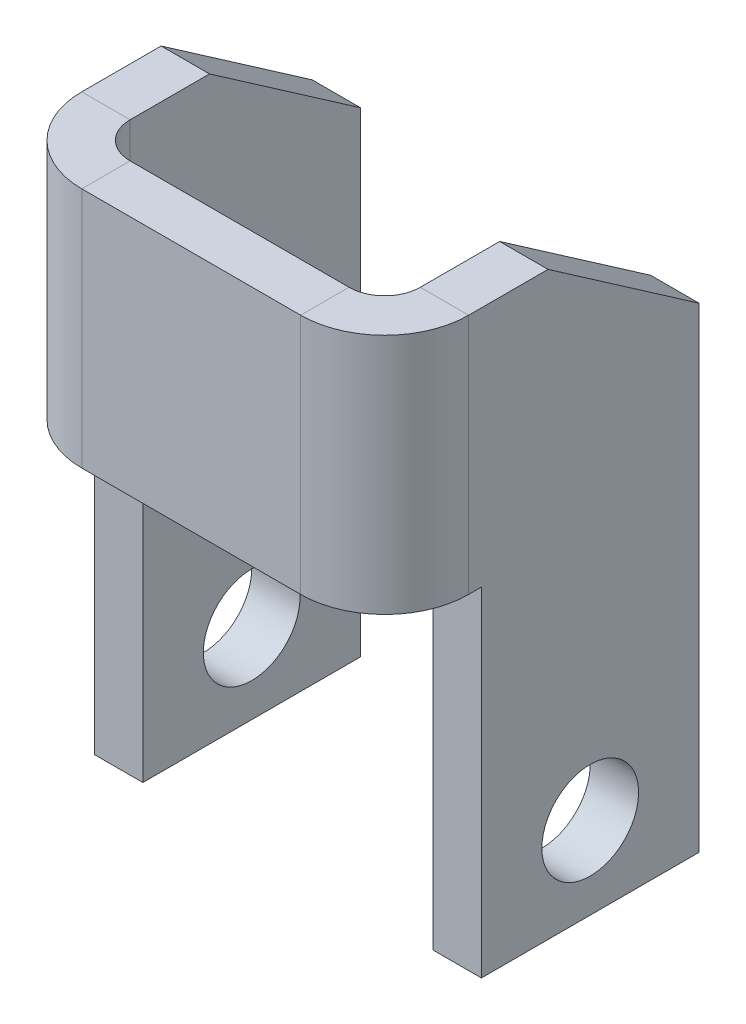
ISO-10303-21;
HEADER;
FILE_DESCRIPTION(('STEP AP214'),'2;1');
FILE_NAME('part.step','',(''),(''),'','','');
FILE_SCHEMA(('AUTOMOTIVE_DESIGN { 1 0 10303 214 1 1 1 1 }'));
ENDSEC;
DATA;
#1=APPLICATION_CONTEXT('core data for automotive mechanical design processes');
#2=APPLICATION_PROTOCOL_DEFINITION('international standard','automotive_design',2000,#1);
#3=PRODUCT_CONTEXT('',#1,'mechanical');
#4=PRODUCT('Part','Part','',(#3));
#5=PRODUCT_RELATED_PRODUCT_CATEGORY('part','',(#4));
#6=PRODUCT_DEFINITION_FORMATION('','',#4);
#7=PRODUCT_DEFINITION_CONTEXT('part definition',#1,'design');
#8=PRODUCT_DEFINITION('design','',#6,#7);
#9=PRODUCT_DEFINITION_SHAPE('','',#8);
#10=(LENGTH_UNIT() NAMED_UNIT(*) SI_UNIT(.MILLI.,.METRE.));
#11=(NAMED_UNIT(*) PLANE_ANGLE_UNIT() SI_UNIT($,.RADIAN.));
#12=(NAMED_UNIT(*) SI_UNIT($,.STERADIAN.) SOLID_ANGLE_UNIT());
#13=UNCERTAINTY_MEASURE_WITH_UNIT(LENGTH_MEASURE(1.E-05),#10,'distance_accuracy_value','');
#14=(GEOMETRIC_REPRESENTATION_CONTEXT(3) GLOBAL_UNCERTAINTY_ASSIGNED_CONTEXT((#13)) GLOBAL_UNIT_ASSIGNED_CONTEXT((#10,
#11,#12)) REPRESENTATION_CONTEXT('',''));
#15=CARTESIAN_POINT('',(0.,0.,0.));
#16=DIRECTION('',(0.,0.,1.));
#17=DIRECTION('',(1.,0.,0.));
#18=AXIS2_PLACEMENT_3D('',#15,#16,#17);
#19=CARTESIAN_POINT('',(0.,0.,-1.));
#20=DIRECTION('',(0.,0.,-1.));
#21=DIRECTION('',(-1.,0.,0.));
#22=AXIS2_PLACEMENT_3D('',#19,#20,#21);
#23=PLANE('',#22);
#24=DIRECTION('',(0.,1.,0.));
#25=VECTOR('',#24,1.);
#26=CARTESIAN_POINT('',(-2.2634,10.5,-1.));
#27=LINE('',#26,#25);
#28=CARTESIAN_POINT('',(-2.2634,1.5,-1.));
#29=VERTEX_POINT('',#28);
#30=CARTESIAN_POINT('',(-2.2634,-3.5,-1.));
#31=VERTEX_POINT('',#30);
#32=EDGE_CURVE('E234',#29,#31,#27,.F.);
#33=ORIENTED_EDGE('',*,*,#32,.F.);
#34=DIRECTION('',(-1.,0.,0.));
#35=VECTOR('',#34,1.);
#36=CARTESIAN_POINT('',(0.,1.5,-1.));
#37=LINE('',#36,#35);
#38=CARTESIAN_POINT('',(2.2634,1.5,-1.));
#39=VERTEX_POINT('',#38);
#40=EDGE_CURVE('E221',#39,#29,#37,.T.);
#41=ORIENTED_EDGE('',*,*,#40,.F.);
#42=DIRECTION('',(0.,-1.,0.));
#43=VECTOR('',#42,1.);
#44=CARTESIAN_POINT('',(2.2634,-10.5,-1.));
#45=LINE('',#44,#43);
#46=CARTESIAN_POINT('',(2.2634,-3.5,-1.));
#47=VERTEX_POINT('',#46);
#48=EDGE_CURVE('E292',#47,#39,#45,.F.);
#49=ORIENTED_EDGE('',*,*,#48,.F.);
#50=DIRECTION('',(1.,0.,0.));
#51=VECTOR('',#50,1.);
#52=CARTESIAN_POINT('',(0.,-3.5,-1.));
#53=LINE('',#52,#51);
#54=EDGE_CURVE('E241',#31,#47,#53,.T.);
#55=ORIENTED_EDGE('',*,*,#54,.F.);
#56=EDGE_LOOP('',(#33,#41,#49,#55));
#57=FACE_BOUND('',#56,.T.);
#58=ADVANCED_FACE('F80',(#57),#23,.T.);
#59=CARTESIAN_POINT('',(0.,0.,0.));
#60=DIRECTION('',(0.,0.,-1.));
#61=DIRECTION('',(-1.,0.,0.));
#62=AXIS2_PLACEMENT_3D('',#59,#60,#61);
#63=PLANE('',#62);
#64=DIRECTION('',(-1.,0.,0.));
#65=VECTOR('',#64,1.);
#66=CARTESIAN_POINT('',(0.,1.5,0.));
#67=LINE('',#66,#65);
#68=CARTESIAN_POINT('',(2.2634,1.5,0.));
#69=VERTEX_POINT('',#68);
#70=CARTESIAN_POINT('',(-2.2634,1.5,0.));
#71=VERTEX_POINT('',#70);
#72=EDGE_CURVE('E228',#69,#71,#67,.T.);
#73=ORIENTED_EDGE('',*,*,#72,.T.);
#74=DIRECTION('',(0.,1.,0.));
#75=VECTOR('',#74,1.);
#76=CARTESIAN_POINT('',(-2.2634,10.5,0.));
#77=LINE('',#76,#75);
#78=CARTESIAN_POINT('',(-2.26340000000001,-3.5,0.));
#79=VERTEX_POINT('',#78);
#80=EDGE_CURVE('E242',#71,#79,#77,.F.);
#81=ORIENTED_EDGE('',*,*,#80,.T.);
#82=DIRECTION('',(1.,0.,0.));
#83=VECTOR('',#82,1.);
#84=CARTESIAN_POINT('',(-6.,-3.5,0.));
#85=LINE('',#84,#83);
#86=CARTESIAN_POINT('',(2.2634,-3.5,0.));
#87=VERTEX_POINT('',#86);
#88=EDGE_CURVE('E265',#79,#87,#85,.T.);
#89=ORIENTED_EDGE('',*,*,#88,.T.);
#90=DIRECTION('',(0.,-1.,0.));
#91=VECTOR('',#90,1.);
#92=CARTESIAN_POINT('',(2.2634,-10.5,0.));
#93=LINE('',#92,#91);
#94=EDGE_CURVE('E283',#87,#69,#93,.F.);
#95=ORIENTED_EDGE('',*,*,#94,.T.);
#96=EDGE_LOOP('',(#73,#81,#89,#95));
#97=FACE_BOUND('',#96,.T.);
#98=ADVANCED_FACE('F82',(#97),#63,.F.);
#99=CARTESIAN_POINT('',(-2.2634,10.5,-1.7366));
#100=DIRECTION('',(0.,1.,0.));
#101=DIRECTION('',(-1.,0.,0.));
#102=AXIS2_PLACEMENT_3D('',#99,#100,#101);
#103=CYLINDRICAL_SURFACE('',#102,1.7366);
#104=ORIENTED_EDGE('',*,*,#80,.F.);
#105=CARTESIAN_POINT('',(-2.2634,1.5,-1.7366));
#106=DIRECTION('',(0.,-1.,0.));
#107=DIRECTION('',(0.,0.,-1.));
#108=AXIS2_PLACEMENT_3D('',#105,#106,#107);
#109=CIRCLE('',#108,1.7366);
#110=CARTESIAN_POINT('',(-4.,1.5,-1.73659999999999));
#111=VERTEX_POINT('',#110);
#112=EDGE_CURVE('E213',#111,#71,#109,.F.);
#113=ORIENTED_EDGE('',*,*,#112,.F.);
#114=DIRECTION('',(0.,1.,0.));
#115=VECTOR('',#114,1.);
#116=CARTESIAN_POINT('',(-4.,-10.5,-1.73659999999999));
#117=LINE('',#116,#115);
#118=CARTESIAN_POINT('',(-4.,-3.5,-1.73659999999999));
#119=VERTEX_POINT('',#118);
#120=EDGE_CURVE('E294',#111,#119,#117,.F.);
#121=ORIENTED_EDGE('',*,*,#120,.T.);
#122=CARTESIAN_POINT('',(-2.2634,-3.5,-1.7366));
#123=DIRECTION('',(0.,1.,0.));
#124=DIRECTION('',(0.,0.,1.));
#125=AXIS2_PLACEMENT_3D('',#122,#123,#124);
#126=CIRCLE('',#125,1.7366);
#127=EDGE_CURVE('E314',#79,#119,#126,.F.);
#128=ORIENTED_EDGE('',*,*,#127,.F.);
#129=EDGE_LOOP('',(#104,#113,#121,#128));
#130=FACE_BOUND('',#129,.T.);
#131=ADVANCED_FACE('F312',(#130),#103,.T.);
#132=CARTESIAN_POINT('',(-2.2634,10.5,-1.7366));
#133=DIRECTION('',(0.,1.,0.));
#134=DIRECTION('',(-1.,0.,0.));
#135=AXIS2_PLACEMENT_3D('',#132,#133,#134);
#136=CYLINDRICAL_SURFACE('',#135,0.7366);
#137=CARTESIAN_POINT('',(-2.2634,1.5,-1.7366));
#138=DIRECTION('',(0.,1.,0.));
#139=DIRECTION('',(0.,0.,1.));
#140=AXIS2_PLACEMENT_3D('',#137,#138,#139);
#141=CIRCLE('',#140,0.7366);
#142=CARTESIAN_POINT('',(-3.,1.5,-1.7366));
#143=VERTEX_POINT('',#142);
#144=EDGE_CURVE('E210',#143,#29,#141,.T.);
#145=ORIENTED_EDGE('',*,*,#144,.T.);
#146=ORIENTED_EDGE('',*,*,#32,.T.);
#147=CARTESIAN_POINT('',(-2.2634,-3.5,-1.7366));
#148=DIRECTION('',(0.,1.,0.));
#149=DIRECTION('',(0.,0.,1.));
#150=AXIS2_PLACEMENT_3D('',#147,#148,#149);
#151=CIRCLE('',#150,0.7366);
#152=CARTESIAN_POINT('',(-3.,-3.5,-1.7366));
#153=VERTEX_POINT('',#152);
#154=EDGE_CURVE('E382',#31,#153,#151,.F.);
#155=ORIENTED_EDGE('',*,*,#154,.T.);
#156=DIRECTION('',(0.,1.,0.));
#157=VECTOR('',#156,1.);
#158=CARTESIAN_POINT('',(-3.,-10.5,-1.7366));
#159=LINE('',#158,#157);
#160=EDGE_CURVE('E237',#153,#143,#159,.T.);
#161=ORIENTED_EDGE('',*,*,#160,.T.);
#162=EDGE_LOOP('',(#145,#146,#155,#161));
#163=FACE_BOUND('',#162,.T.);
#164=ADVANCED_FACE('F232',(#163),#136,.F.);
#165=CARTESIAN_POINT('',(-4.,0.,0.));
#166=DIRECTION('',(1.,0.,0.));
#167=DIRECTION('',(0.,0.,-1.));
#168=AXIS2_PLACEMENT_3D('',#165,#166,#167);
#169=PLANE('',#168);
#170=CARTESIAN_POINT('',(-4.00000000000001,-8.8,-4.25000000000003));
#171=DIRECTION('',(1.,0.,0.));
#172=DIRECTION('',(0.,0.,-1.));
#173=AXIS2_PLACEMENT_3D('',#170,#171,#172);
#174=CIRCLE('',#173,1.);
#175=CARTESIAN_POINT('',(-4.00000000000002,-8.8,-5.25000000000003));
#176=VERTEX_POINT('',#175);
#177=EDGE_CURVE('E413',#176,#176,#174,.F.);
#178=ORIENTED_EDGE('',*,*,#177,.F.);
#179=EDGE_LOOP('',(#178));
#180=FACE_BOUND('',#179,.T.);
#181=DIRECTION('',(0.,-0.570049767381845,-0.821610164681465));
#182=VECTOR('',#181,1.);
#183=CARTESIAN_POINT('',(-4.,2.59445903024732,-1.80008820514969));
#184=LINE('',#183,#182);
#185=CARTESIAN_POINT('',(-4.00000000000001,1.5,-3.37752708072121));
#186=VERTEX_POINT('',#185);
#187=CARTESIAN_POINT('',(-4.00000000000002,-0.666434932047232,-6.50000000000003));
#188=VERTEX_POINT('',#187);
#189=EDGE_CURVE('E402',#186,#188,#184,.T.);
#190=ORIENTED_EDGE('',*,*,#189,.T.);
#191=DIRECTION('',(0.,-1.,0.));
#192=VECTOR('',#191,1.);
#193=CARTESIAN_POINT('',(-4.00000000000002,0.,-6.5));
#194=LINE('',#193,#192);
#195=CARTESIAN_POINT('',(-4.00000000000002,-10.5,-6.5));
#196=VERTEX_POINT('',#195);
#197=EDGE_CURVE('E303',#188,#196,#194,.T.);
#198=ORIENTED_EDGE('',*,*,#197,.T.);
#199=DIRECTION('',(0.,0.,1.));
#200=VECTOR('',#199,1.);
#201=CARTESIAN_POINT('',(-4.,-10.5,0.));
#202=LINE('',#201,#200);
#203=CARTESIAN_POINT('',(-4.,-10.5,-2.00000000000002));
#204=VERTEX_POINT('',#203);
#205=EDGE_CURVE('E248',#196,#204,#202,.T.);
#206=ORIENTED_EDGE('',*,*,#205,.T.);
#207=DIRECTION('',(0.,1.,0.));
#208=VECTOR('',#207,1.);
#209=CARTESIAN_POINT('',(-4.,0.,-2.00000000000002));
#210=LINE('',#209,#208);
#211=CARTESIAN_POINT('',(-4.,-3.5,-2.00000000000002));
#212=VERTEX_POINT('',#211);
#213=EDGE_CURVE('E331',#204,#212,#210,.T.);
#214=ORIENTED_EDGE('',*,*,#213,.T.);
#215=DIRECTION('',(0.,0.,1.));
#216=VECTOR('',#215,1.);
#217=CARTESIAN_POINT('',(-4.,-3.5,0.));
#218=LINE('',#217,#216);
#219=EDGE_CURVE('E278',#212,#119,#218,.T.);
#220=ORIENTED_EDGE('',*,*,#219,.T.);
#221=ORIENTED_EDGE('',*,*,#120,.F.);
#222=DIRECTION('',(0.,0.,-1.));
#223=VECTOR('',#222,1.);
#224=CARTESIAN_POINT('',(-4.,1.5,0.));
#225=LINE('',#224,#223);
#226=EDGE_CURVE('E398',#111,#186,#225,.T.);
#227=ORIENTED_EDGE('',*,*,#226,.T.);
#228=EDGE_LOOP('',(#190,#198,#206,#214,#220,#221,#227));
#229=FACE_BOUND('',#228,.T.);
#230=ADVANCED_FACE('F330',(#180,#229),#169,.F.);
#231=CARTESIAN_POINT('',(-3.,0.,0.));
#232=DIRECTION('',(1.,0.,0.));
#233=DIRECTION('',(0.,0.,-1.));
#234=AXIS2_PLACEMENT_3D('',#231,#232,#233);
#235=PLANE('',#234);
#236=CARTESIAN_POINT('',(-3.00000000000001,-8.8,-4.25000000000002));
#237=DIRECTION('',(1.,0.,0.));
#238=DIRECTION('',(0.,0.,-1.));
#239=AXIS2_PLACEMENT_3D('',#236,#237,#238);
#240=CIRCLE('',#239,1.);
#241=CARTESIAN_POINT('',(-3.00000000000001,-8.8,-5.25000000000002));
#242=VERTEX_POINT('',#241);
#243=EDGE_CURVE('E416',#242,#242,#240,.T.);
#244=ORIENTED_EDGE('',*,*,#243,.F.);
#245=EDGE_LOOP('',(#244));
#246=FACE_BOUND('',#245,.T.);
#247=DIRECTION('',(0.,1.,0.));
#248=VECTOR('',#247,1.);
#249=CARTESIAN_POINT('',(-3.00000000000002,-10.5,-6.5));
#250=LINE('',#249,#248);
#251=CARTESIAN_POINT('',(-3.00000000000002,-0.666434932047232,-6.50000000000003));
#252=VERTEX_POINT('',#251);
#253=CARTESIAN_POINT('',(-3.00000000000002,-10.5,-6.5));
#254=VERTEX_POINT('',#253);
#255=EDGE_CURVE('E308',#252,#254,#250,.F.);
#256=ORIENTED_EDGE('',*,*,#255,.F.);
#257=DIRECTION('',(0.,-0.570049767381845,-0.821610164681465));
#258=VECTOR('',#257,1.);
#259=CARTESIAN_POINT('',(-3.,2.59445903024732,-1.80008820514969));
#260=LINE('',#259,#258);
#261=CARTESIAN_POINT('',(-3.00000000000001,1.5,-3.37752708072121));
#262=VERTEX_POINT('',#261);
#263=EDGE_CURVE('E390',#262,#252,#260,.T.);
#264=ORIENTED_EDGE('',*,*,#263,.F.);
#265=DIRECTION('',(0.,0.,-1.));
#266=VECTOR('',#265,1.);
#267=CARTESIAN_POINT('',(-3.,1.5,0.));
#268=LINE('',#267,#266);
#269=EDGE_CURVE('E389',#143,#262,#268,.T.);
#270=ORIENTED_EDGE('',*,*,#269,.F.);
#271=ORIENTED_EDGE('',*,*,#160,.F.);
#272=DIRECTION('',(0.,0.,1.));
#273=VECTOR('',#272,1.);
#274=CARTESIAN_POINT('',(-3.,-3.5,0.));
#275=LINE('',#274,#273);
#276=CARTESIAN_POINT('',(-3.,-3.5,-2.00000000000002));
#277=VERTEX_POINT('',#276);
#278=EDGE_CURVE('E279',#277,#153,#275,.T.);
#279=ORIENTED_EDGE('',*,*,#278,.F.);
#280=DIRECTION('',(0.,1.,0.));
#281=VECTOR('',#280,1.);
#282=CARTESIAN_POINT('',(-3.,0.,-2.00000000000002));
#283=LINE('',#282,#281);
#284=CARTESIAN_POINT('',(-3.,-10.5,-2.00000000000002));
#285=VERTEX_POINT('',#284);
#286=EDGE_CURVE('E286',#285,#277,#283,.T.);
#287=ORIENTED_EDGE('',*,*,#286,.F.);
#288=DIRECTION('',(0.,0.,-1.));
#289=VECTOR('',#288,1.);
#290=CARTESIAN_POINT('',(-3.,-10.5,-1.));
#291=LINE('',#290,#289);
#292=EDGE_CURVE('E305',#254,#285,#291,.F.);
#293=ORIENTED_EDGE('',*,*,#292,.F.);
#294=EDGE_LOOP('',(#256,#264,#270,#271,#279,#287,#293));
#295=FACE_BOUND('',#294,.T.);
#296=ADVANCED_FACE('F386',(#246,#295),#235,.T.);
#297=CARTESIAN_POINT('',(-4.00000000000002,-10.5,-6.5));
#298=DIRECTION('',(0.,0.,1.));
#299=DIRECTION('',(1.,0.,0.));
#300=AXIS2_PLACEMENT_3D('',#297,#298,#299);
#301=PLANE('',#300);
#302=DIRECTION('',(-1.,0.,0.));
#303=VECTOR('',#302,1.);
#304=CARTESIAN_POINT('',(-4.00000000000002,-0.666434932047232,-6.50000000000003));
#305=LINE('',#304,#303);
#306=EDGE_CURVE('E396',#188,#252,#305,.F.);
#307=ORIENTED_EDGE('',*,*,#306,.T.);
#308=ORIENTED_EDGE('',*,*,#255,.T.);
#309=DIRECTION('',(1.,0.,0.));
#310=VECTOR('',#309,1.);
#311=CARTESIAN_POINT('',(-4.00000000000002,-10.5,-6.5));
#312=LINE('',#311,#310);
#313=EDGE_CURVE('E243',#196,#254,#312,.T.);
#314=ORIENTED_EDGE('',*,*,#313,.F.);
#315=ORIENTED_EDGE('',*,*,#197,.F.);
#316=EDGE_LOOP('',(#307,#308,#314,#315));
#317=FACE_BOUND('',#316,.T.);
#318=ADVANCED_FACE('F468',(#317),#301,.F.);
#319=CARTESIAN_POINT('',(2.2634,-10.5,-1.7366));
#320=DIRECTION('',(0.,-1.,0.));
#321=DIRECTION('',(1.,0.,0.));
#322=AXIS2_PLACEMENT_3D('',#319,#320,#321);
#323=CYLINDRICAL_SURFACE('',#322,1.7366);
#324=DIRECTION('',(0.,-1.,0.));
#325=VECTOR('',#324,1.);
#326=CARTESIAN_POINT('',(4.,10.5,-1.73659999999999));
#327=LINE('',#326,#325);
#328=CARTESIAN_POINT('',(4.,-3.5,-1.73659999999999));
#329=VERTEX_POINT('',#328);
#330=CARTESIAN_POINT('',(4.,1.5,-1.73659999999999));
#331=VERTEX_POINT('',#330);
#332=EDGE_CURVE('E346',#329,#331,#327,.F.);
#333=ORIENTED_EDGE('',*,*,#332,.T.);
#334=CARTESIAN_POINT('',(2.2634,1.5,-1.7366));
#335=DIRECTION('',(0.,-1.,0.));
#336=DIRECTION('',(0.,0.,-1.));
#337=AXIS2_PLACEMENT_3D('',#334,#335,#336);
#338=CIRCLE('',#337,1.7366);
#339=EDGE_CURVE('E291',#69,#331,#338,.F.);
#340=ORIENTED_EDGE('',*,*,#339,.F.);
#341=ORIENTED_EDGE('',*,*,#94,.F.);
#342=CARTESIAN_POINT('',(2.2634,-3.5,-1.7366));
#343=DIRECTION('',(0.,1.,0.));
#344=DIRECTION('',(0.,0.,1.));
#345=AXIS2_PLACEMENT_3D('',#342,#343,#344);
#346=CIRCLE('',#345,1.7366);
#347=EDGE_CURVE('E271',#329,#87,#346,.F.);
#348=ORIENTED_EDGE('',*,*,#347,.F.);
#349=EDGE_LOOP('',(#333,#340,#341,#348));
#350=FACE_BOUND('',#349,.T.);
#351=ADVANCED_FACE('F290',(#350),#323,.T.);
#352=CARTESIAN_POINT('',(2.2634,-10.5,-1.7366));
#353=DIRECTION('',(0.,-1.,0.));
#354=DIRECTION('',(1.,0.,0.));
#355=AXIS2_PLACEMENT_3D('',#352,#353,#354);
#356=CYLINDRICAL_SURFACE('',#355,0.7366);
#357=CARTESIAN_POINT('',(2.2634,1.5,-1.7366));
#358=DIRECTION('',(0.,-1.,0.));
#359=DIRECTION('',(0.,0.,-1.));
#360=AXIS2_PLACEMENT_3D('',#357,#358,#359);
#361=CIRCLE('',#360,0.7366);
#362=CARTESIAN_POINT('',(3.,1.5,-1.7366));
#363=VERTEX_POINT('',#362);
#364=EDGE_CURVE('E352',#39,#363,#361,.F.);
#365=ORIENTED_EDGE('',*,*,#364,.T.);
#366=DIRECTION('',(0.,-1.,0.));
#367=VECTOR('',#366,1.);
#368=CARTESIAN_POINT('',(3.,10.5,-1.7366));
#369=LINE('',#368,#367);
#370=CARTESIAN_POINT('',(3.,-3.5,-1.7366));
#371=VERTEX_POINT('',#370);
#372=EDGE_CURVE('E298',#363,#371,#369,.T.);
#373=ORIENTED_EDGE('',*,*,#372,.T.);
#374=CARTESIAN_POINT('',(2.2634,-3.5,-1.7366));
#375=DIRECTION('',(0.,1.,0.));
#376=DIRECTION('',(0.,0.,1.));
#377=AXIS2_PLACEMENT_3D('',#374,#375,#376);
#378=CIRCLE('',#377,0.7366);
#379=EDGE_CURVE('E351',#371,#47,#378,.F.);
#380=ORIENTED_EDGE('',*,*,#379,.T.);
#381=ORIENTED_EDGE('',*,*,#48,.T.);
#382=EDGE_LOOP('',(#365,#373,#380,#381));
#383=FACE_BOUND('',#382,.T.);
#384=ADVANCED_FACE('F350',(#383),#356,.F.);
#385=CARTESIAN_POINT('',(4.,0.,0.));
#386=DIRECTION('',(-1.,0.,0.));
#387=DIRECTION('',(0.,0.,1.));
#388=AXIS2_PLACEMENT_3D('',#385,#386,#387);
#389=PLANE('',#388);
#390=CARTESIAN_POINT('',(4.00000000000001,-8.8,-4.25));
#391=DIRECTION('',(1.,0.,0.));
#392=DIRECTION('',(0.,0.,1.));
#393=AXIS2_PLACEMENT_3D('',#390,#391,#392);
#394=CIRCLE('',#393,1.);
#395=CARTESIAN_POINT('',(4.00000000000001,-8.8,-3.25));
#396=VERTEX_POINT('',#395);
#397=EDGE_CURVE('E409',#396,#396,#394,.T.);
#398=ORIENTED_EDGE('',*,*,#397,.F.);
#399=EDGE_LOOP('',(#398));
#400=FACE_BOUND('',#399,.T.);
#401=DIRECTION('',(0.,0.,1.));
#402=VECTOR('',#401,1.);
#403=CARTESIAN_POINT('',(4.,1.5,0.));
#404=LINE('',#403,#402);
#405=CARTESIAN_POINT('',(4.00000000000001,1.5,-3.37752708072118));
#406=VERTEX_POINT('',#405);
#407=EDGE_CURVE('E422',#406,#331,#404,.T.);
#408=ORIENTED_EDGE('',*,*,#407,.T.);
#409=ORIENTED_EDGE('',*,*,#332,.F.);
#410=DIRECTION('',(0.,0.,1.));
#411=VECTOR('',#410,1.);
#412=CARTESIAN_POINT('',(4.,-3.5,0.));
#413=LINE('',#412,#411);
#414=CARTESIAN_POINT('',(4.,-3.5,-2.));
#415=VERTEX_POINT('',#414);
#416=EDGE_CURVE('E360',#415,#329,#413,.T.);
#417=ORIENTED_EDGE('',*,*,#416,.F.);
#418=DIRECTION('',(0.,1.,0.));
#419=VECTOR('',#418,1.);
#420=CARTESIAN_POINT('',(4.,-10.5,-1.99999999999999));
#421=LINE('',#420,#419);
#422=CARTESIAN_POINT('',(4.,-10.5,-1.99999999999999));
#423=VERTEX_POINT('',#422);
#424=EDGE_CURVE('E375',#423,#415,#421,.T.);
#425=ORIENTED_EDGE('',*,*,#424,.F.);
#426=DIRECTION('',(0.,0.,-1.));
#427=VECTOR('',#426,1.);
#428=CARTESIAN_POINT('',(4.,-10.5,0.));
#429=LINE('',#428,#427);
#430=CARTESIAN_POINT('',(4.00000000000002,-10.5,-6.5));
#431=VERTEX_POINT('',#430);
#432=EDGE_CURVE('E340',#423,#431,#429,.T.);
#433=ORIENTED_EDGE('',*,*,#432,.T.);
#434=DIRECTION('',(0.,1.,0.));
#435=VECTOR('',#434,1.);
#436=CARTESIAN_POINT('',(4.00000000000002,0.,-6.5));
#437=LINE('',#436,#435);
#438=CARTESIAN_POINT('',(4.00000000000002,-0.666434932047233,-6.5));
#439=VERTEX_POINT('',#438);
#440=EDGE_CURVE('E337',#431,#439,#437,.T.);
#441=ORIENTED_EDGE('',*,*,#440,.T.);
#442=DIRECTION('',(0.,0.570049767381845,0.821610164681465));
#443=VECTOR('',#442,1.);
#444=CARTESIAN_POINT('',(4.,2.59445903024731,-1.80008820514968));
#445=LINE('',#444,#443);
#446=EDGE_CURVE('E96',#439,#406,#445,.T.);
#447=ORIENTED_EDGE('',*,*,#446,.T.);
#448=EDGE_LOOP('',(#408,#409,#417,#425,#433,#441,#447));
#449=FACE_BOUND('',#448,.T.);
#450=ADVANCED_FACE('F421',(#400,#449),#389,.F.);
#451=CARTESIAN_POINT('',(3.,0.,0.));
#452=DIRECTION('',(-1.,0.,0.));
#453=DIRECTION('',(0.,0.,1.));
#454=AXIS2_PLACEMENT_3D('',#451,#452,#453);
#455=PLANE('',#454);
#456=CARTESIAN_POINT('',(3.00000000000001,-8.8,-4.25));
#457=DIRECTION('',(-1.,0.,0.));
#458=DIRECTION('',(0.,0.,1.));
#459=AXIS2_PLACEMENT_3D('',#456,#457,#458);
#460=CIRCLE('',#459,1.);
#461=CARTESIAN_POINT('',(3.00000000000001,-8.8,-3.25));
#462=VERTEX_POINT('',#461);
#463=EDGE_CURVE('E84',#462,#462,#460,.T.);
#464=ORIENTED_EDGE('',*,*,#463,.F.);
#465=EDGE_LOOP('',(#464));
#466=FACE_BOUND('',#465,.T.);
#467=ORIENTED_EDGE('',*,*,#372,.F.);
#468=DIRECTION('',(0.,0.,1.));
#469=VECTOR('',#468,1.);
#470=CARTESIAN_POINT('',(3.,1.5,0.));
#471=LINE('',#470,#469);
#472=CARTESIAN_POINT('',(3.00000000000001,1.5,-3.37752708072118));
#473=VERTEX_POINT('',#472);
#474=EDGE_CURVE('E430',#473,#363,#471,.T.);
#475=ORIENTED_EDGE('',*,*,#474,.F.);
#476=DIRECTION('',(0.,0.570049767381845,0.821610164681465));
#477=VECTOR('',#476,1.);
#478=CARTESIAN_POINT('',(3.,2.59445903024731,-1.80008820514968));
#479=LINE('',#478,#477);
#480=CARTESIAN_POINT('',(3.00000000000002,-0.666434932047233,-6.5));
#481=VERTEX_POINT('',#480);
#482=EDGE_CURVE('E216',#481,#473,#479,.T.);
#483=ORIENTED_EDGE('',*,*,#482,.F.);
#484=DIRECTION('',(0.,-1.,0.));
#485=VECTOR('',#484,1.);
#486=CARTESIAN_POINT('',(3.00000000000002,10.5,-6.5));
#487=LINE('',#486,#485);
#488=CARTESIAN_POINT('',(3.00000000000002,-10.5,-6.5));
#489=VERTEX_POINT('',#488);
#490=EDGE_CURVE('E342',#489,#481,#487,.F.);
#491=ORIENTED_EDGE('',*,*,#490,.F.);
#492=DIRECTION('',(0.,0.,1.));
#493=VECTOR('',#492,1.);
#494=CARTESIAN_POINT('',(3.00000000000002,-10.5,-6.5));
#495=LINE('',#494,#493);
#496=CARTESIAN_POINT('',(3.,-10.5,-2.));
#497=VERTEX_POINT('',#496);
#498=EDGE_CURVE('E345',#497,#489,#495,.F.);
#499=ORIENTED_EDGE('',*,*,#498,.F.);
#500=DIRECTION('',(0.,-1.,0.));
#501=VECTOR('',#500,1.);
#502=CARTESIAN_POINT('',(3.,0.,-2.));
#503=LINE('',#502,#501);
#504=CARTESIAN_POINT('',(3.,-3.5,-2.));
#505=VERTEX_POINT('',#504);
#506=EDGE_CURVE('E245',#505,#497,#503,.T.);
#507=ORIENTED_EDGE('',*,*,#506,.F.);
#508=DIRECTION('',(0.,0.,-1.));
#509=VECTOR('',#508,1.);
#510=CARTESIAN_POINT('',(3.,-3.5,0.));
#511=LINE('',#510,#509);
#512=EDGE_CURVE('E253',#371,#505,#511,.T.);
#513=ORIENTED_EDGE('',*,*,#512,.F.);
#514=EDGE_LOOP('',(#467,#475,#483,#491,#499,#507,#513));
#515=FACE_BOUND('',#514,.T.);
#516=ADVANCED_FACE('F362',(#466,#515),#455,.T.);
#517=CARTESIAN_POINT('',(4.00000000000002,10.5,-6.5));
#518=DIRECTION('',(0.,0.,1.));
#519=DIRECTION('',(1.,0.,0.));
#520=AXIS2_PLACEMENT_3D('',#517,#518,#519);
#521=PLANE('',#520);
#522=DIRECTION('',(-1.,0.,0.));
#523=VECTOR('',#522,1.);
#524=CARTESIAN_POINT('',(3.00000000000002,-0.666434932047233,-6.5));
#525=LINE('',#524,#523);
#526=EDGE_CURVE('E426',#481,#439,#525,.F.);
#527=ORIENTED_EDGE('',*,*,#526,.T.);
#528=ORIENTED_EDGE('',*,*,#440,.F.);
#529=DIRECTION('',(-1.,0.,0.));
#530=VECTOR('',#529,1.);
#531=CARTESIAN_POINT('',(4.00000000000002,-10.5,-6.5));
#532=LINE('',#531,#530);
#533=EDGE_CURVE('E295',#431,#489,#532,.T.);
#534=ORIENTED_EDGE('',*,*,#533,.T.);
#535=ORIENTED_EDGE('',*,*,#490,.T.);
#536=EDGE_LOOP('',(#527,#528,#534,#535));
#537=FACE_BOUND('',#536,.T.);
#538=ADVANCED_FACE('F446',(#537),#521,.F.);
#539=CARTESIAN_POINT('',(-6.,-3.5,0.));
#540=DIRECTION('',(0.,1.,0.));
#541=DIRECTION('',(0.,0.,1.));
#542=AXIS2_PLACEMENT_3D('',#539,#540,#541);
#543=PLANE('',#542);
#544=ORIENTED_EDGE('',*,*,#416,.T.);
#545=DIRECTION('',(-1.,0.,0.));
#546=VECTOR('',#545,1.);
#547=CARTESIAN_POINT('',(4.,-3.5,-1.73659999999999));
#548=LINE('',#547,#546);
#549=EDGE_CURVE('E13',#329,#371,#548,.T.);
#550=ORIENTED_EDGE('',*,*,#549,.T.);
#551=ORIENTED_EDGE('',*,*,#512,.T.);
#552=DIRECTION('',(1.,0.,0.));
#553=VECTOR('',#552,1.);
#554=CARTESIAN_POINT('',(-6.,-3.5,-2.00000000000003));
#555=LINE('',#554,#553);
#556=EDGE_CURVE('E104',#505,#415,#555,.T.);
#557=ORIENTED_EDGE('',*,*,#556,.T.);
#558=EDGE_LOOP('',(#544,#550,#551,#557));
#559=FACE_BOUND('',#558,.T.);
#560=ADVANCED_FACE('F357',(#559),#543,.F.);
#561=ORIENTED_EDGE('',*,*,#54,.T.);
#562=DIRECTION('',(0.,0.,1.));
#563=VECTOR('',#562,1.);
#564=CARTESIAN_POINT('',(2.2634,-3.5,-1.));
#565=LINE('',#564,#563);
#566=EDGE_CURVE('E89',#47,#87,#565,.T.);
#567=ORIENTED_EDGE('',*,*,#566,.T.);
#568=ORIENTED_EDGE('',*,*,#88,.F.);
#569=DIRECTION('',(0.,0.,-1.));
#570=VECTOR('',#569,1.);
#571=CARTESIAN_POINT('',(-2.26340000000001,-3.5,0.));
#572=LINE('',#571,#570);
#573=EDGE_CURVE('E255',#79,#31,#572,.T.);
#574=ORIENTED_EDGE('',*,*,#573,.T.);
#575=EDGE_LOOP('',(#561,#567,#568,#574));
#576=FACE_BOUND('',#575,.T.);
#577=ADVANCED_FACE('F263',(#576),#543,.F.);
#578=ORIENTED_EDGE('',*,*,#278,.T.);
#579=DIRECTION('',(-1.,0.,0.));
#580=VECTOR('',#579,1.);
#581=CARTESIAN_POINT('',(-3.,-3.5,-1.7366));
#582=LINE('',#581,#580);
#583=EDGE_CURVE('E257',#153,#119,#582,.T.);
#584=ORIENTED_EDGE('',*,*,#583,.T.);
#585=ORIENTED_EDGE('',*,*,#219,.F.);
#586=EDGE_CURVE('E287',#212,#277,#555,.T.);
#587=ORIENTED_EDGE('',*,*,#586,.T.);
#588=EDGE_LOOP('',(#578,#584,#585,#587));
#589=FACE_BOUND('',#588,.T.);
#590=ADVANCED_FACE('F320',(#589),#543,.F.);
#591=ORIENTED_EDGE('',*,*,#549,.F.);
#592=ORIENTED_EDGE('',*,*,#347,.T.);
#593=ORIENTED_EDGE('',*,*,#566,.F.);
#594=ORIENTED_EDGE('',*,*,#379,.F.);
#595=EDGE_LOOP('',(#591,#592,#593,#594));
#596=FACE_BOUND('',#595,.T.);
#597=ADVANCED_FACE('F272',(#596),#543,.F.);
#598=CARTESIAN_POINT('',(-4.,-10.5,-0.999999999999997));
#599=DIRECTION('',(0.,1.,0.));
#600=DIRECTION('',(0.,0.,1.));
#601=AXIS2_PLACEMENT_3D('',#598,#599,#600);
#602=PLANE('',#601);
#603=ORIENTED_EDGE('',*,*,#292,.T.);
#604=DIRECTION('',(1.,0.,0.));
#605=VECTOR('',#604,1.);
#606=CARTESIAN_POINT('',(-6.,-10.5,-2.00000000000003));
#607=LINE('',#606,#605);
#608=EDGE_CURVE('E373',#204,#285,#607,.T.);
#609=ORIENTED_EDGE('',*,*,#608,.F.);
#610=ORIENTED_EDGE('',*,*,#205,.F.);
#611=ORIENTED_EDGE('',*,*,#313,.T.);
#612=EDGE_LOOP('',(#603,#609,#610,#611));
#613=FACE_BOUND('',#612,.T.);
#614=ADVANCED_FACE('F472',(#613),#602,.F.);
#615=CARTESIAN_POINT('',(4.00000000000002,-10.5,-6.5));
#616=DIRECTION('',(0.,1.,0.));
#617=DIRECTION('',(0.,0.,1.));
#618=AXIS2_PLACEMENT_3D('',#615,#616,#617);
#619=PLANE('',#618);
#620=ORIENTED_EDGE('',*,*,#432,.F.);
#621=EDGE_CURVE('E367',#497,#423,#607,.T.);
#622=ORIENTED_EDGE('',*,*,#621,.F.);
#623=ORIENTED_EDGE('',*,*,#498,.T.);
#624=ORIENTED_EDGE('',*,*,#533,.F.);
#625=EDGE_LOOP('',(#620,#622,#623,#624));
#626=FACE_BOUND('',#625,.T.);
#627=ADVANCED_FACE('F371',(#626),#619,.F.);
#628=CARTESIAN_POINT('',(-6.,-10.5,-2.00000000000003));
#629=DIRECTION('',(0.,0.,-1.));
#630=DIRECTION('',(-1.,0.,0.));
#631=AXIS2_PLACEMENT_3D('',#628,#629,#630);
#632=PLANE('',#631);
#633=ORIENTED_EDGE('',*,*,#608,.T.);
#634=ORIENTED_EDGE('',*,*,#286,.T.);
#635=ORIENTED_EDGE('',*,*,#586,.F.);
#636=ORIENTED_EDGE('',*,*,#213,.F.);
#637=EDGE_LOOP('',(#633,#634,#635,#636));
#638=FACE_BOUND('',#637,.T.);
#639=ADVANCED_FACE('F488',(#638),#632,.F.);
#640=ORIENTED_EDGE('',*,*,#583,.F.);
#641=ORIENTED_EDGE('',*,*,#154,.F.);
#642=ORIENTED_EDGE('',*,*,#573,.F.);
#643=ORIENTED_EDGE('',*,*,#127,.T.);
#644=EDGE_LOOP('',(#640,#641,#642,#643));
#645=FACE_BOUND('',#644,.T.);
#646=ADVANCED_FACE('F326',(#645),#543,.F.);
#647=ORIENTED_EDGE('',*,*,#506,.T.);
#648=ORIENTED_EDGE('',*,*,#621,.T.);
#649=ORIENTED_EDGE('',*,*,#424,.T.);
#650=ORIENTED_EDGE('',*,*,#556,.F.);
#651=EDGE_LOOP('',(#647,#648,#649,#650));
#652=FACE_BOUND('',#651,.T.);
#653=ADVANCED_FACE('F366',(#652),#632,.F.);
#654=CARTESIAN_POINT('',(-6.8284271247462,-8.8,-4.25000000000004));
#655=DIRECTION('',(1.,0.,0.));
#656=DIRECTION('',(0.,0.,-1.));
#657=AXIS2_PLACEMENT_3D('',#654,#655,#656);
#658=CYLINDRICAL_SURFACE('',#657,1.);
#659=ORIENTED_EDGE('',*,*,#463,.T.);
#660=EDGE_LOOP('',(#659));
#661=FACE_BOUND('',#660,.T.);
#662=ORIENTED_EDGE('',*,*,#397,.T.);
#663=EDGE_LOOP('',(#662));
#664=FACE_BOUND('',#663,.T.);
#665=ADVANCED_FACE('F499',(#661,#664),#658,.F.);
#666=ORIENTED_EDGE('',*,*,#243,.T.);
#667=EDGE_LOOP('',(#666));
#668=FACE_BOUND('',#667,.T.);
#669=ORIENTED_EDGE('',*,*,#177,.T.);
#670=EDGE_LOOP('',(#669));
#671=FACE_BOUND('',#670,.T.);
#672=ADVANCED_FACE('F504',(#668,#671),#658,.F.);
#673=CARTESIAN_POINT('',(-4.,2.59445903024732,-1.80008820514969));
#674=DIRECTION('',(0.,-0.821610164681465,0.570049767381845));
#675=DIRECTION('',(0.,-0.570049767381845,-0.821610164681465));
#676=AXIS2_PLACEMENT_3D('',#673,#674,#675);
#677=PLANE('',#676);
#678=ORIENTED_EDGE('',*,*,#306,.F.);
#679=ORIENTED_EDGE('',*,*,#189,.F.);
#680=DIRECTION('',(-1.,0.,0.));
#681=VECTOR('',#680,1.);
#682=CARTESIAN_POINT('',(-4.00000000000001,1.5,-3.37752708072121));
#683=LINE('',#682,#681);
#684=EDGE_CURVE('E394',#186,#262,#683,.F.);
#685=ORIENTED_EDGE('',*,*,#684,.T.);
#686=ORIENTED_EDGE('',*,*,#263,.T.);
#687=EDGE_LOOP('',(#678,#679,#685,#686));
#688=FACE_BOUND('',#687,.T.);
#689=ADVANCED_FACE('F508',(#688),#677,.F.);
#690=CARTESIAN_POINT('',(-4.,1.5,0.));
#691=DIRECTION('',(0.,-1.,0.));
#692=DIRECTION('',(0.,0.,-1.));
#693=AXIS2_PLACEMENT_3D('',#690,#691,#692);
#694=PLANE('',#693);
#695=ORIENTED_EDGE('',*,*,#226,.F.);
#696=DIRECTION('',(-1.,0.,0.));
#697=VECTOR('',#696,1.);
#698=CARTESIAN_POINT('',(-4.,1.5,-1.73659999999999));
#699=LINE('',#698,#697);
#700=EDGE_CURVE('E408',#111,#143,#699,.F.);
#701=ORIENTED_EDGE('',*,*,#700,.T.);
#702=ORIENTED_EDGE('',*,*,#269,.T.);
#703=ORIENTED_EDGE('',*,*,#684,.F.);
#704=EDGE_LOOP('',(#695,#701,#702,#703));
#705=FACE_BOUND('',#704,.T.);
#706=ADVANCED_FACE('F456',(#705),#694,.F.);
#707=CARTESIAN_POINT('',(3.,1.5,0.));
#708=DIRECTION('',(0.,-1.,0.));
#709=DIRECTION('',(0.,0.,1.));
#710=AXIS2_PLACEMENT_3D('',#707,#708,#709);
#711=PLANE('',#710);
#712=DIRECTION('',(-1.,0.,0.));
#713=VECTOR('',#712,1.);
#714=CARTESIAN_POINT('',(3.00000000000001,1.5,-3.37752708072118));
#715=LINE('',#714,#713);
#716=EDGE_CURVE('E404',#473,#406,#715,.F.);
#717=ORIENTED_EDGE('',*,*,#716,.F.);
#718=ORIENTED_EDGE('',*,*,#474,.T.);
#719=DIRECTION('',(-1.,0.,0.));
#720=VECTOR('',#719,1.);
#721=CARTESIAN_POINT('',(3.,1.5,-1.7366));
#722=LINE('',#721,#720);
#723=EDGE_CURVE('E428',#363,#331,#722,.F.);
#724=ORIENTED_EDGE('',*,*,#723,.T.);
#725=ORIENTED_EDGE('',*,*,#407,.F.);
#726=EDGE_LOOP('',(#717,#718,#724,#725));
#727=FACE_BOUND('',#726,.T.);
#728=ADVANCED_FACE('F443',(#727),#711,.F.);
#729=CARTESIAN_POINT('',(3.,2.59445903024731,-1.80008820514968));
#730=DIRECTION('',(0.,-0.821610164681465,0.570049767381845));
#731=DIRECTION('',(0.,0.570049767381845,0.821610164681465));
#732=AXIS2_PLACEMENT_3D('',#729,#730,#731);
#733=PLANE('',#732);
#734=ORIENTED_EDGE('',*,*,#482,.T.);
#735=ORIENTED_EDGE('',*,*,#716,.T.);
#736=ORIENTED_EDGE('',*,*,#446,.F.);
#737=ORIENTED_EDGE('',*,*,#526,.F.);
#738=EDGE_LOOP('',(#734,#735,#736,#737));
#739=FACE_BOUND('',#738,.T.);
#740=ADVANCED_FACE('F448',(#739),#733,.F.);
#741=CARTESIAN_POINT('',(2.2634,1.5,-1.7366));
#742=DIRECTION('',(0.,1.,0.));
#743=DIRECTION('',(0.,0.,1.));
#744=AXIS2_PLACEMENT_3D('',#741,#742,#743);
#745=PLANE('',#744);
#746=ORIENTED_EDGE('',*,*,#723,.F.);
#747=ORIENTED_EDGE('',*,*,#364,.F.);
#748=DIRECTION('',(0.,0.,-1.));
#749=VECTOR('',#748,1.);
#750=CARTESIAN_POINT('',(2.2634,1.5,-1.));
#751=LINE('',#750,#749);
#752=EDGE_CURVE('E217',#39,#69,#751,.F.);
#753=ORIENTED_EDGE('',*,*,#752,.T.);
#754=ORIENTED_EDGE('',*,*,#339,.T.);
#755=EDGE_LOOP('',(#746,#747,#753,#754));
#756=FACE_BOUND('',#755,.T.);
#757=ADVANCED_FACE('F441',(#756),#745,.T.);
#758=CARTESIAN_POINT('',(0.,1.5,-1.));
#759=DIRECTION('',(0.,-1.,0.));
#760=DIRECTION('',(-1.,0.,0.));
#761=AXIS2_PLACEMENT_3D('',#758,#759,#760);
#762=PLANE('',#761);
#763=ORIENTED_EDGE('',*,*,#40,.T.);
#764=DIRECTION('',(0.,0.,-1.));
#765=VECTOR('',#764,1.);
#766=CARTESIAN_POINT('',(-2.2634,1.5,-1.));
#767=LINE('',#766,#765);
#768=EDGE_CURVE('E206',#29,#71,#767,.F.);
#769=ORIENTED_EDGE('',*,*,#768,.T.);
#770=ORIENTED_EDGE('',*,*,#72,.F.);
#771=ORIENTED_EDGE('',*,*,#752,.F.);
#772=EDGE_LOOP('',(#763,#769,#770,#771));
#773=FACE_BOUND('',#772,.T.);
#774=ADVANCED_FACE('F222',(#773),#762,.F.);
#775=CARTESIAN_POINT('',(-2.2634,1.5,-1.7366));
#776=DIRECTION('',(0.,1.,0.));
#777=DIRECTION('',(0.,0.,1.));
#778=AXIS2_PLACEMENT_3D('',#775,#776,#777);
#779=PLANE('',#778);
#780=ORIENTED_EDGE('',*,*,#112,.T.);
#781=ORIENTED_EDGE('',*,*,#768,.F.);
#782=ORIENTED_EDGE('',*,*,#144,.F.);
#783=ORIENTED_EDGE('',*,*,#700,.F.);
#784=EDGE_LOOP('',(#780,#781,#782,#783));
#785=FACE_BOUND('',#784,.T.);
#786=ADVANCED_FACE('F208',(#785),#779,.T.);
#787=CLOSED_SHELL('',(#58,#98,#131,#164,#230,#296,#318,#351,#384,#450,#516,#538,#560,#577,#590,
#597,#614,#627,#639,#646,#653,#665,#672,#689,#706,#728,#740,#757,#774,#786));
#788=MANIFOLD_SOLID_BREP('B2',#787);
#789=ADVANCED_BREP_SHAPE_REPRESENTATION('',(#18,#788),#14);
#790=SHAPE_DEFINITION_REPRESENTATION(#9,#789);
ENDSEC;
END-ISO-10303-21;
